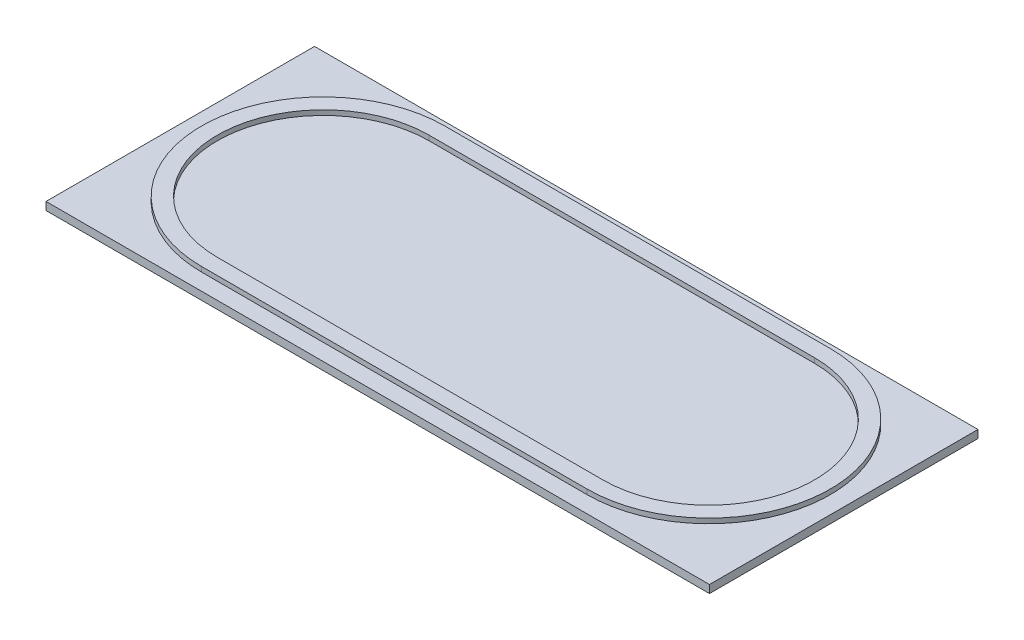
ISO-10303-21;
HEADER;
FILE_DESCRIPTION(('STEP AP214'),'2;1');
FILE_NAME('part.step','',(''),(''),'','','');
FILE_SCHEMA(('AUTOMOTIVE_DESIGN { 1 0 10303 214 1 1 1 1 }'));
ENDSEC;
DATA;
#1=APPLICATION_CONTEXT('core data for automotive mechanical design processes');
#2=APPLICATION_PROTOCOL_DEFINITION('international standard','automotive_design',2000,#1);
#3=PRODUCT_CONTEXT('',#1,'mechanical');
#4=PRODUCT('Part','Part','',(#3));
#5=PRODUCT_RELATED_PRODUCT_CATEGORY('part','',(#4));
#6=PRODUCT_DEFINITION_FORMATION('','',#4);
#7=PRODUCT_DEFINITION_CONTEXT('part definition',#1,'design');
#8=PRODUCT_DEFINITION('design','',#6,#7);
#9=PRODUCT_DEFINITION_SHAPE('','',#8);
#10=(LENGTH_UNIT() NAMED_UNIT(*) SI_UNIT(.MILLI.,.METRE.));
#11=(NAMED_UNIT(*) PLANE_ANGLE_UNIT() SI_UNIT($,.RADIAN.));
#12=(NAMED_UNIT(*) SI_UNIT($,.STERADIAN.) SOLID_ANGLE_UNIT());
#13=UNCERTAINTY_MEASURE_WITH_UNIT(LENGTH_MEASURE(1.E-05),#10,'distance_accuracy_value','');
#14=(GEOMETRIC_REPRESENTATION_CONTEXT(3) GLOBAL_UNCERTAINTY_ASSIGNED_CONTEXT((#13)) GLOBAL_UNIT_ASSIGNED_CONTEXT((#10,
#11,#12)) REPRESENTATION_CONTEXT('',''));
#15=CARTESIAN_POINT('',(0.,0.,0.));
#16=DIRECTION('',(0.,0.,1.));
#17=DIRECTION('',(1.,0.,0.));
#18=AXIS2_PLACEMENT_3D('',#15,#16,#17);
#19=CARTESIAN_POINT('',(-310.,7.874,0.));
#20=DIRECTION('',(0.,1.,0.));
#21=DIRECTION('',(0.,0.,1.));
#22=AXIS2_PLACEMENT_3D('',#19,#20,#21);
#23=PLANE('',#22);
#24=CARTESIAN_POINT('',(-310.,7.874,0.));
#25=DIRECTION('',(0.,1.,0.));
#26=DIRECTION('',(0.,0.,1.));
#27=AXIS2_PLACEMENT_3D('',#24,#25,#26);
#28=CIRCLE('',#27,195.58);
#29=CARTESIAN_POINT('',(-310.,7.874,-195.58));
#30=VERTEX_POINT('',#29);
#31=CARTESIAN_POINT('',(-310.,7.874,195.58));
#32=VERTEX_POINT('',#31);
#33=EDGE_CURVE('E136',#30,#32,#28,.T.);
#34=ORIENTED_EDGE('',*,*,#33,.T.);
#35=DIRECTION('',(1.,0.,0.));
#36=VECTOR('',#35,1.);
#37=CARTESIAN_POINT('',(-310.,7.874,195.58));
#38=LINE('',#37,#36);
#39=CARTESIAN_POINT('',(310.,7.874,195.58));
#40=VERTEX_POINT('',#39);
#41=EDGE_CURVE('E130',#32,#40,#38,.T.);
#42=ORIENTED_EDGE('',*,*,#41,.T.);
#43=CARTESIAN_POINT('',(310.,7.874,0.));
#44=DIRECTION('',(0.,-1.,0.));
#45=DIRECTION('',(0.,0.,-1.));
#46=AXIS2_PLACEMENT_3D('',#43,#44,#45);
#47=CIRCLE('',#46,195.58);
#48=CARTESIAN_POINT('',(310.,7.874,-195.58));
#49=VERTEX_POINT('',#48);
#50=EDGE_CURVE('E135',#49,#40,#47,.T.);
#51=ORIENTED_EDGE('',*,*,#50,.F.);
#52=DIRECTION('',(1.,0.,0.));
#53=VECTOR('',#52,1.);
#54=CARTESIAN_POINT('',(-310.,7.874,-195.58));
#55=LINE('',#54,#53);
#56=EDGE_CURVE('E147',#30,#49,#55,.T.);
#57=ORIENTED_EDGE('',*,*,#56,.F.);
#58=EDGE_LOOP('',(#34,#42,#51,#57));
#59=FACE_BOUND('',#58,.T.);
#60=DIRECTION('',(1.,0.,0.));
#61=VECTOR('',#60,1.);
#62=CARTESIAN_POINT('',(-310.,7.874,170.18));
#63=LINE('',#62,#61);
#64=CARTESIAN_POINT('',(-310.,7.874,170.18));
#65=VERTEX_POINT('',#64);
#66=CARTESIAN_POINT('',(310.,7.874,170.18));
#67=VERTEX_POINT('',#66);
#68=EDGE_CURVE('E177',#65,#67,#63,.T.);
#69=ORIENTED_EDGE('',*,*,#68,.F.);
#70=CARTESIAN_POINT('',(-310.,7.874,0.));
#71=DIRECTION('',(0.,1.,0.));
#72=DIRECTION('',(0.,0.,1.));
#73=AXIS2_PLACEMENT_3D('',#70,#71,#72);
#74=CIRCLE('',#73,170.18);
#75=CARTESIAN_POINT('',(-310.,7.874,-170.18));
#76=VERTEX_POINT('',#75);
#77=EDGE_CURVE('E172',#76,#65,#74,.T.);
#78=ORIENTED_EDGE('',*,*,#77,.F.);
#79=DIRECTION('',(1.,0.,0.));
#80=VECTOR('',#79,1.);
#81=CARTESIAN_POINT('',(-310.,7.874,-170.18));
#82=LINE('',#81,#80);
#83=CARTESIAN_POINT('',(310.,7.874,-170.18));
#84=VERTEX_POINT('',#83);
#85=EDGE_CURVE('E189',#76,#84,#82,.T.);
#86=ORIENTED_EDGE('',*,*,#85,.T.);
#87=CARTESIAN_POINT('',(310.,7.874,0.));
#88=DIRECTION('',(0.,-1.,0.));
#89=DIRECTION('',(0.,0.,-1.));
#90=AXIS2_PLACEMENT_3D('',#87,#88,#89);
#91=CIRCLE('',#90,170.18);
#92=EDGE_CURVE('E82',#84,#67,#91,.T.);
#93=ORIENTED_EDGE('',*,*,#92,.T.);
#94=EDGE_LOOP('',(#69,#78,#86,#93));
#95=FACE_BOUND('',#94,.T.);
#96=ADVANCED_FACE('F67',(#59,#95),#23,.T.);
#97=CARTESIAN_POINT('',(-310.,7.874,0.));
#98=DIRECTION('',(0.,-1.,0.));
#99=DIRECTION('',(0.,0.,-1.));
#100=AXIS2_PLACEMENT_3D('',#97,#98,#99);
#101=CYLINDRICAL_SURFACE('',#100,195.58);
#102=CARTESIAN_POINT('',(-310.,0.,0.));
#103=DIRECTION('',(0.,1.,0.));
#104=DIRECTION('',(0.,0.,1.));
#105=AXIS2_PLACEMENT_3D('',#102,#103,#104);
#106=CIRCLE('',#105,195.58);
#107=CARTESIAN_POINT('',(-310.,0.,-195.58));
#108=VERTEX_POINT('',#107);
#109=CARTESIAN_POINT('',(-310.,0.,195.58));
#110=VERTEX_POINT('',#109);
#111=EDGE_CURVE('E152',#108,#110,#106,.T.);
#112=ORIENTED_EDGE('',*,*,#111,.T.);
#113=DIRECTION('',(0.,-1.,0.));
#114=VECTOR('',#113,1.);
#115=CARTESIAN_POINT('',(-310.,7.874,195.58));
#116=LINE('',#115,#114);
#117=EDGE_CURVE('E12',#32,#110,#116,.T.);
#118=ORIENTED_EDGE('',*,*,#117,.F.);
#119=ORIENTED_EDGE('',*,*,#33,.F.);
#120=DIRECTION('',(0.,-1.,0.));
#121=VECTOR('',#120,1.);
#122=CARTESIAN_POINT('',(-310.,7.874,-195.58));
#123=LINE('',#122,#121);
#124=EDGE_CURVE('E91',#30,#108,#123,.T.);
#125=ORIENTED_EDGE('',*,*,#124,.T.);
#126=EDGE_LOOP('',(#112,#118,#119,#125));
#127=FACE_BOUND('',#126,.T.);
#128=ADVANCED_FACE('F69',(#127),#101,.T.);
#129=CARTESIAN_POINT('',(-310.,7.874,195.58));
#130=DIRECTION('',(0.,0.,-1.));
#131=DIRECTION('',(-1.,0.,0.));
#132=AXIS2_PLACEMENT_3D('',#129,#130,#131);
#133=PLANE('',#132);
#134=DIRECTION('',(1.,0.,0.));
#135=VECTOR('',#134,1.);
#136=CARTESIAN_POINT('',(-310.,0.,195.58));
#137=LINE('',#136,#135);
#138=CARTESIAN_POINT('',(310.,0.,195.58));
#139=VERTEX_POINT('',#138);
#140=EDGE_CURVE('E142',#110,#139,#137,.T.);
#141=ORIENTED_EDGE('',*,*,#140,.T.);
#142=DIRECTION('',(0.,-1.,0.));
#143=VECTOR('',#142,1.);
#144=CARTESIAN_POINT('',(310.,7.874,195.58));
#145=LINE('',#144,#143);
#146=EDGE_CURVE('E75',#40,#139,#145,.T.);
#147=ORIENTED_EDGE('',*,*,#146,.F.);
#148=ORIENTED_EDGE('',*,*,#41,.F.);
#149=ORIENTED_EDGE('',*,*,#117,.T.);
#150=EDGE_LOOP('',(#141,#147,#148,#149));
#151=FACE_BOUND('',#150,.T.);
#152=ADVANCED_FACE('F141',(#151),#133,.F.);
#153=CARTESIAN_POINT('',(310.,7.874,0.));
#154=DIRECTION('',(0.,-1.,0.));
#155=DIRECTION('',(0.,0.,-1.));
#156=AXIS2_PLACEMENT_3D('',#153,#154,#155);
#157=CYLINDRICAL_SURFACE('',#156,195.58);
#158=CARTESIAN_POINT('',(310.,0.,0.));
#159=DIRECTION('',(0.,-1.,0.));
#160=DIRECTION('',(0.,0.,-1.));
#161=AXIS2_PLACEMENT_3D('',#158,#159,#160);
#162=CIRCLE('',#161,195.58);
#163=CARTESIAN_POINT('',(310.,0.,-195.58));
#164=VERTEX_POINT('',#163);
#165=EDGE_CURVE('E105',#164,#139,#162,.T.);
#166=ORIENTED_EDGE('',*,*,#165,.F.);
#167=DIRECTION('',(0.,-1.,0.));
#168=VECTOR('',#167,1.);
#169=CARTESIAN_POINT('',(310.,7.874,-195.58));
#170=LINE('',#169,#168);
#171=EDGE_CURVE('E144',#49,#164,#170,.T.);
#172=ORIENTED_EDGE('',*,*,#171,.F.);
#173=ORIENTED_EDGE('',*,*,#50,.T.);
#174=ORIENTED_EDGE('',*,*,#146,.T.);
#175=EDGE_LOOP('',(#166,#172,#173,#174));
#176=FACE_BOUND('',#175,.T.);
#177=ADVANCED_FACE('F145',(#176),#157,.T.);
#178=CARTESIAN_POINT('',(-310.,7.874,-195.58));
#179=DIRECTION('',(0.,0.,-1.));
#180=DIRECTION('',(-1.,0.,0.));
#181=AXIS2_PLACEMENT_3D('',#178,#179,#180);
#182=PLANE('',#181);
#183=DIRECTION('',(1.,0.,0.));
#184=VECTOR('',#183,1.);
#185=CARTESIAN_POINT('',(-310.,0.,-195.58));
#186=LINE('',#185,#184);
#187=EDGE_CURVE('E158',#108,#164,#186,.T.);
#188=ORIENTED_EDGE('',*,*,#187,.F.);
#189=ORIENTED_EDGE('',*,*,#124,.F.);
#190=ORIENTED_EDGE('',*,*,#56,.T.);
#191=ORIENTED_EDGE('',*,*,#171,.T.);
#192=EDGE_LOOP('',(#188,#189,#190,#191));
#193=FACE_BOUND('',#192,.T.);
#194=ADVANCED_FACE('F162',(#193),#182,.T.);
#195=CARTESIAN_POINT('',(-310.,7.874,0.));
#196=DIRECTION('',(0.,-1.,0.));
#197=DIRECTION('',(0.,0.,-1.));
#198=AXIS2_PLACEMENT_3D('',#195,#196,#197);
#199=CYLINDRICAL_SURFACE('',#198,170.18);
#200=CARTESIAN_POINT('',(-310.,0.,0.));
#201=DIRECTION('',(0.,1.,0.));
#202=DIRECTION('',(0.,0.,1.));
#203=AXIS2_PLACEMENT_3D('',#200,#201,#202);
#204=CIRCLE('',#203,170.18);
#205=CARTESIAN_POINT('',(-310.,0.,-170.18));
#206=VERTEX_POINT('',#205);
#207=CARTESIAN_POINT('',(-310.,0.,170.18));
#208=VERTEX_POINT('',#207);
#209=EDGE_CURVE('E194',#206,#208,#204,.T.);
#210=ORIENTED_EDGE('',*,*,#209,.F.);
#211=DIRECTION('',(0.,-1.,0.));
#212=VECTOR('',#211,1.);
#213=CARTESIAN_POINT('',(-310.,7.874,-170.18));
#214=LINE('',#213,#212);
#215=EDGE_CURVE('E116',#76,#206,#214,.T.);
#216=ORIENTED_EDGE('',*,*,#215,.F.);
#217=ORIENTED_EDGE('',*,*,#77,.T.);
#218=DIRECTION('',(0.,-1.,0.));
#219=VECTOR('',#218,1.);
#220=CARTESIAN_POINT('',(-310.,7.874,170.18));
#221=LINE('',#220,#219);
#222=EDGE_CURVE('E155',#65,#208,#221,.T.);
#223=ORIENTED_EDGE('',*,*,#222,.T.);
#224=EDGE_LOOP('',(#210,#216,#217,#223));
#225=FACE_BOUND('',#224,.T.);
#226=ADVANCED_FACE('F174',(#225),#199,.F.);
#227=CARTESIAN_POINT('',(-310.,7.874,170.18));
#228=DIRECTION('',(0.,0.,-1.));
#229=DIRECTION('',(-1.,0.,0.));
#230=AXIS2_PLACEMENT_3D('',#227,#228,#229);
#231=PLANE('',#230);
#232=DIRECTION('',(1.,0.,0.));
#233=VECTOR('',#232,1.);
#234=CARTESIAN_POINT('',(-310.,0.,170.18));
#235=LINE('',#234,#233);
#236=CARTESIAN_POINT('',(310.,0.,170.18));
#237=VERTEX_POINT('',#236);
#238=EDGE_CURVE('E185',#208,#237,#235,.T.);
#239=ORIENTED_EDGE('',*,*,#238,.F.);
#240=ORIENTED_EDGE('',*,*,#222,.F.);
#241=ORIENTED_EDGE('',*,*,#68,.T.);
#242=DIRECTION('',(0.,-1.,0.));
#243=VECTOR('',#242,1.);
#244=CARTESIAN_POINT('',(310.,7.874,170.18));
#245=LINE('',#244,#243);
#246=EDGE_CURVE('E186',#67,#237,#245,.T.);
#247=ORIENTED_EDGE('',*,*,#246,.T.);
#248=EDGE_LOOP('',(#239,#240,#241,#247));
#249=FACE_BOUND('',#248,.T.);
#250=ADVANCED_FACE('F182',(#249),#231,.T.);
#251=CARTESIAN_POINT('',(310.,7.874,0.));
#252=DIRECTION('',(0.,-1.,0.));
#253=DIRECTION('',(0.,0.,-1.));
#254=AXIS2_PLACEMENT_3D('',#251,#252,#253);
#255=CYLINDRICAL_SURFACE('',#254,170.18);
#256=CARTESIAN_POINT('',(310.,0.,0.));
#257=DIRECTION('',(0.,-1.,0.));
#258=DIRECTION('',(0.,0.,-1.));
#259=AXIS2_PLACEMENT_3D('',#256,#257,#258);
#260=CIRCLE('',#259,170.18);
#261=CARTESIAN_POINT('',(310.,0.,-170.18));
#262=VERTEX_POINT('',#261);
#263=EDGE_CURVE('E199',#262,#237,#260,.T.);
#264=ORIENTED_EDGE('',*,*,#263,.T.);
#265=ORIENTED_EDGE('',*,*,#246,.F.);
#266=ORIENTED_EDGE('',*,*,#92,.F.);
#267=DIRECTION('',(0.,-1.,0.));
#268=VECTOR('',#267,1.);
#269=CARTESIAN_POINT('',(310.,7.874,-170.18));
#270=LINE('',#269,#268);
#271=EDGE_CURVE('E205',#84,#262,#270,.T.);
#272=ORIENTED_EDGE('',*,*,#271,.T.);
#273=EDGE_LOOP('',(#264,#265,#266,#272));
#274=FACE_BOUND('',#273,.T.);
#275=ADVANCED_FACE('F210',(#274),#255,.F.);
#276=CARTESIAN_POINT('',(-310.,7.874,-170.18));
#277=DIRECTION('',(0.,0.,-1.));
#278=DIRECTION('',(-1.,0.,0.));
#279=AXIS2_PLACEMENT_3D('',#276,#277,#278);
#280=PLANE('',#279);
#281=DIRECTION('',(1.,0.,0.));
#282=VECTOR('',#281,1.);
#283=CARTESIAN_POINT('',(-310.,0.,-170.18));
#284=LINE('',#283,#282);
#285=EDGE_CURVE('E178',#206,#262,#284,.T.);
#286=ORIENTED_EDGE('',*,*,#285,.T.);
#287=ORIENTED_EDGE('',*,*,#271,.F.);
#288=ORIENTED_EDGE('',*,*,#85,.F.);
#289=ORIENTED_EDGE('',*,*,#215,.T.);
#290=EDGE_LOOP('',(#286,#287,#288,#289));
#291=FACE_BOUND('',#290,.T.);
#292=ADVANCED_FACE('F217',(#291),#280,.F.);
#293=CARTESIAN_POINT('',(0.,0.,0.));
#294=DIRECTION('',(0.,1.,0.));
#295=DIRECTION('',(0.,0.,1.));
#296=AXIS2_PLACEMENT_3D('',#293,#294,#295);
#297=PLANE('',#296);
#298=ORIENTED_EDGE('',*,*,#285,.F.);
#299=ORIENTED_EDGE('',*,*,#209,.T.);
#300=ORIENTED_EDGE('',*,*,#238,.T.);
#301=ORIENTED_EDGE('',*,*,#263,.F.);
#302=EDGE_LOOP('',(#298,#299,#300,#301));
#303=FACE_BOUND('',#302,.T.);
#304=ADVANCED_FACE('F213',(#303),#297,.T.);
#305=DIRECTION('',(1.,0.,0.));
#306=VECTOR('',#305,1.);
#307=CARTESIAN_POINT('',(-533.4,0.,222.25));
#308=LINE('',#307,#306);
#309=CARTESIAN_POINT('',(-533.4,0.,222.25));
#310=VERTEX_POINT('',#309);
#311=CARTESIAN_POINT('',(533.4,0.,222.25));
#312=VERTEX_POINT('',#311);
#313=EDGE_CURVE('E398',#310,#312,#308,.T.);
#314=ORIENTED_EDGE('',*,*,#313,.T.);
#315=DIRECTION('',(0.,0.,-1.));
#316=VECTOR('',#315,1.);
#317=CARTESIAN_POINT('',(533.4,0.,222.25));
#318=LINE('',#317,#316);
#319=CARTESIAN_POINT('',(533.4,0.,-209.55));
#320=VERTEX_POINT('',#319);
#321=EDGE_CURVE('E401',#312,#320,#318,.T.);
#322=ORIENTED_EDGE('',*,*,#321,.T.);
#323=DIRECTION('',(1.,0.,0.));
#324=VECTOR('',#323,1.);
#325=CARTESIAN_POINT('',(-533.4,0.,-209.55));
#326=LINE('',#325,#324);
#327=CARTESIAN_POINT('',(-533.4,0.,-209.55));
#328=VERTEX_POINT('',#327);
#329=EDGE_CURVE('E392',#328,#320,#326,.T.);
#330=ORIENTED_EDGE('',*,*,#329,.F.);
#331=DIRECTION('',(0.,0.,-1.));
#332=VECTOR('',#331,1.);
#333=CARTESIAN_POINT('',(-533.4,0.,222.25));
#334=LINE('',#333,#332);
#335=EDGE_CURVE('E387',#310,#328,#334,.T.);
#336=ORIENTED_EDGE('',*,*,#335,.F.);
#337=EDGE_LOOP('',(#314,#322,#330,#336));
#338=FACE_BOUND('',#337,.T.);
#339=ORIENTED_EDGE('',*,*,#111,.F.);
#340=ORIENTED_EDGE('',*,*,#187,.T.);
#341=ORIENTED_EDGE('',*,*,#165,.T.);
#342=ORIENTED_EDGE('',*,*,#140,.F.);
#343=EDGE_LOOP('',(#339,#340,#341,#342));
#344=FACE_BOUND('',#343,.T.);
#345=ADVANCED_FACE('F225',(#338,#344),#297,.T.);
#346=CARTESIAN_POINT('',(-533.4,-12.7,222.25));
#347=DIRECTION('',(0.,0.,1.));
#348=DIRECTION('',(1.,0.,0.));
#349=AXIS2_PLACEMENT_3D('',#346,#347,#348);
#350=PLANE('',#349);
#351=ORIENTED_EDGE('',*,*,#313,.F.);
#352=DIRECTION('',(0.,1.,0.));
#353=VECTOR('',#352,1.);
#354=CARTESIAN_POINT('',(-533.4,-12.7,222.25));
#355=LINE('',#354,#353);
#356=CARTESIAN_POINT('',(-533.4,-12.7,222.25));
#357=VERTEX_POINT('',#356);
#358=EDGE_CURVE('E197',#357,#310,#355,.T.);
#359=ORIENTED_EDGE('',*,*,#358,.F.);
#360=DIRECTION('',(1.,0.,0.));
#361=VECTOR('',#360,1.);
#362=CARTESIAN_POINT('',(-533.4,-12.7,222.25));
#363=LINE('',#362,#361);
#364=CARTESIAN_POINT('',(533.4,-12.7,222.25));
#365=VERTEX_POINT('',#364);
#366=EDGE_CURVE('E375',#357,#365,#363,.T.);
#367=ORIENTED_EDGE('',*,*,#366,.T.);
#368=DIRECTION('',(0.,1.,0.));
#369=VECTOR('',#368,1.);
#370=CARTESIAN_POINT('',(533.4,-12.7,222.25));
#371=LINE('',#370,#369);
#372=EDGE_CURVE('E397',#365,#312,#371,.T.);
#373=ORIENTED_EDGE('',*,*,#372,.T.);
#374=EDGE_LOOP('',(#351,#359,#367,#373));
#375=FACE_BOUND('',#374,.T.);
#376=ADVANCED_FACE('F295',(#375),#350,.T.);
#377=CARTESIAN_POINT('',(-533.4,-12.7,222.25));
#378=DIRECTION('',(1.,0.,0.));
#379=DIRECTION('',(0.,0.,-1.));
#380=AXIS2_PLACEMENT_3D('',#377,#378,#379);
#381=PLANE('',#380);
#382=ORIENTED_EDGE('',*,*,#335,.T.);
#383=DIRECTION('',(0.,1.,0.));
#384=VECTOR('',#383,1.);
#385=CARTESIAN_POINT('',(-533.4,-12.7,-209.55));
#386=LINE('',#385,#384);
#387=CARTESIAN_POINT('',(-533.4,-12.7,-209.55));
#388=VERTEX_POINT('',#387);
#389=EDGE_CURVE('E408',#388,#328,#386,.T.);
#390=ORIENTED_EDGE('',*,*,#389,.F.);
#391=DIRECTION('',(0.,0.,-1.));
#392=VECTOR('',#391,1.);
#393=CARTESIAN_POINT('',(-533.4,-12.7,222.25));
#394=LINE('',#393,#392);
#395=EDGE_CURVE('E379',#357,#388,#394,.T.);
#396=ORIENTED_EDGE('',*,*,#395,.F.);
#397=ORIENTED_EDGE('',*,*,#358,.T.);
#398=EDGE_LOOP('',(#382,#390,#396,#397));
#399=FACE_BOUND('',#398,.T.);
#400=ADVANCED_FACE('F306',(#399),#381,.F.);
#401=CARTESIAN_POINT('',(-533.4,-12.7,-209.55));
#402=DIRECTION('',(0.,0.,1.));
#403=DIRECTION('',(1.,0.,0.));
#404=AXIS2_PLACEMENT_3D('',#401,#402,#403);
#405=PLANE('',#404);
#406=ORIENTED_EDGE('',*,*,#329,.T.);
#407=DIRECTION('',(0.,1.,0.));
#408=VECTOR('',#407,1.);
#409=CARTESIAN_POINT('',(533.4,-12.7,-209.55));
#410=LINE('',#409,#408);
#411=CARTESIAN_POINT('',(533.4,-12.7,-209.55));
#412=VERTEX_POINT('',#411);
#413=EDGE_CURVE('E411',#412,#320,#410,.T.);
#414=ORIENTED_EDGE('',*,*,#413,.F.);
#415=DIRECTION('',(1.,0.,0.));
#416=VECTOR('',#415,1.);
#417=CARTESIAN_POINT('',(-533.4,-12.7,-209.55));
#418=LINE('',#417,#416);
#419=EDGE_CURVE('E389',#388,#412,#418,.T.);
#420=ORIENTED_EDGE('',*,*,#419,.F.);
#421=ORIENTED_EDGE('',*,*,#389,.T.);
#422=EDGE_LOOP('',(#406,#414,#420,#421));
#423=FACE_BOUND('',#422,.T.);
#424=ADVANCED_FACE('F317',(#423),#405,.F.);
#425=CARTESIAN_POINT('',(533.4,-12.7,222.25));
#426=DIRECTION('',(1.,0.,0.));
#427=DIRECTION('',(0.,0.,-1.));
#428=AXIS2_PLACEMENT_3D('',#425,#426,#427);
#429=PLANE('',#428);
#430=ORIENTED_EDGE('',*,*,#321,.F.);
#431=ORIENTED_EDGE('',*,*,#372,.F.);
#432=DIRECTION('',(0.,0.,-1.));
#433=VECTOR('',#432,1.);
#434=CARTESIAN_POINT('',(533.4,-12.7,222.25));
#435=LINE('',#434,#433);
#436=EDGE_CURVE('E383',#365,#412,#435,.T.);
#437=ORIENTED_EDGE('',*,*,#436,.T.);
#438=ORIENTED_EDGE('',*,*,#413,.T.);
#439=EDGE_LOOP('',(#430,#431,#437,#438));
#440=FACE_BOUND('',#439,.T.);
#441=ADVANCED_FACE('F329',(#440),#429,.T.);
#442=CARTESIAN_POINT('',(0.,-12.7,0.));
#443=DIRECTION('',(0.,1.,0.));
#444=DIRECTION('',(0.,0.,1.));
#445=AXIS2_PLACEMENT_3D('',#442,#443,#444);
#446=PLANE('',#445);
#447=ORIENTED_EDGE('',*,*,#366,.F.);
#448=ORIENTED_EDGE('',*,*,#395,.T.);
#449=ORIENTED_EDGE('',*,*,#419,.T.);
#450=ORIENTED_EDGE('',*,*,#436,.F.);
#451=EDGE_LOOP('',(#447,#448,#449,#450));
#452=FACE_BOUND('',#451,.T.);
#453=ADVANCED_FACE('F341',(#452),#446,.F.);
#454=CLOSED_SHELL('',(#96,#128,#152,#177,#194,#226,#250,#275,#292,#304,#345,#376,#400,#424,#441,#453));
#455=MANIFOLD_SOLID_BREP('B2',#454);
#456=ADVANCED_BREP_SHAPE_REPRESENTATION('',(#18,#455),#14);
#457=SHAPE_DEFINITION_REPRESENTATION(#9,#456);
ENDSEC;
END-ISO-10303-21;
